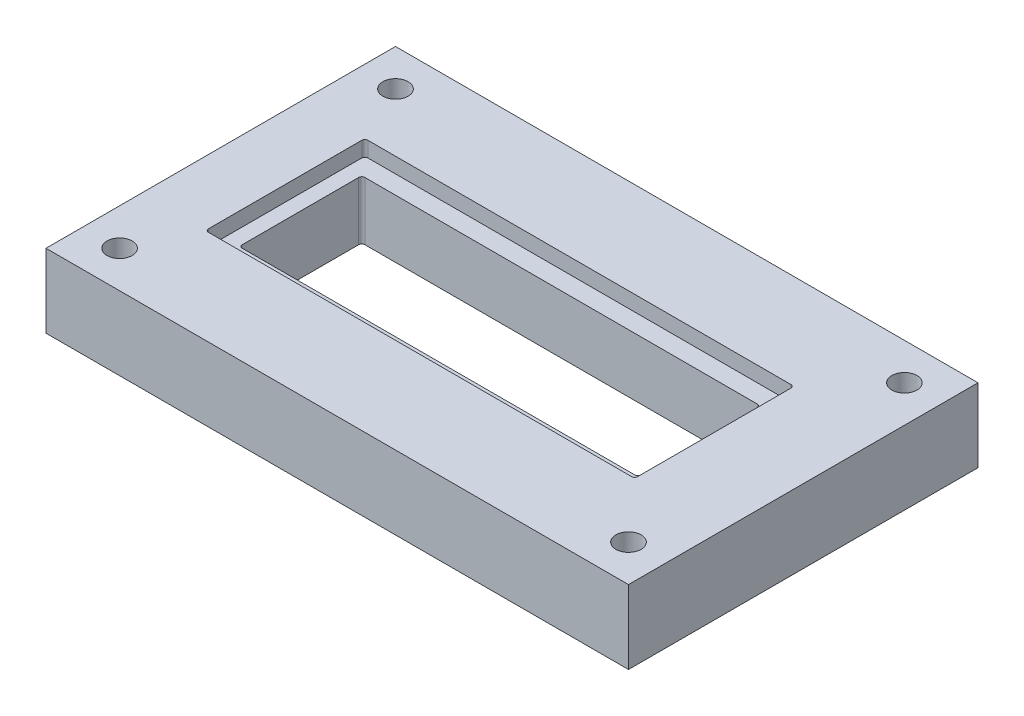
ISO-10303-21;
HEADER;
FILE_DESCRIPTION(('STEP AP214'),'2;1');
FILE_NAME('part.step','',(''),(''),'','','');
FILE_SCHEMA(('AUTOMOTIVE_DESIGN { 1 0 10303 214 1 1 1 1 }'));
ENDSEC;
DATA;
#1=APPLICATION_CONTEXT('core data for automotive mechanical design processes');
#2=APPLICATION_PROTOCOL_DEFINITION('international standard','automotive_design',2000,#1);
#3=PRODUCT_CONTEXT('',#1,'mechanical');
#4=PRODUCT('Part','Part','',(#3));
#5=PRODUCT_RELATED_PRODUCT_CATEGORY('part','',(#4));
#6=PRODUCT_DEFINITION_FORMATION('','',#4);
#7=PRODUCT_DEFINITION_CONTEXT('part definition',#1,'design');
#8=PRODUCT_DEFINITION('design','',#6,#7);
#9=PRODUCT_DEFINITION_SHAPE('','',#8);
#10=(LENGTH_UNIT() NAMED_UNIT(*) SI_UNIT(.MILLI.,.METRE.));
#11=(NAMED_UNIT(*) PLANE_ANGLE_UNIT() SI_UNIT($,.RADIAN.));
#12=(NAMED_UNIT(*) SI_UNIT($,.STERADIAN.) SOLID_ANGLE_UNIT());
#13=UNCERTAINTY_MEASURE_WITH_UNIT(LENGTH_MEASURE(1.E-05),#10,'distance_accuracy_value','');
#14=(GEOMETRIC_REPRESENTATION_CONTEXT(3) GLOBAL_UNCERTAINTY_ASSIGNED_CONTEXT((#13)) GLOBAL_UNIT_ASSIGNED_CONTEXT((#10,
#11,#12)) REPRESENTATION_CONTEXT('',''));
#15=CARTESIAN_POINT('',(0.,0.,0.));
#16=DIRECTION('',(0.,0.,1.));
#17=DIRECTION('',(1.,0.,0.));
#18=AXIS2_PLACEMENT_3D('',#15,#16,#17);
#19=CARTESIAN_POINT('',(-37.,12.,0.));
#20=DIRECTION('',(1.,0.,0.));
#21=DIRECTION('',(0.,0.,-1.));
#22=AXIS2_PLACEMENT_3D('',#19,#20,#21);
#23=PLANE('',#22);
#24=DIRECTION('',(0.,0.,1.));
#25=VECTOR('',#24,1.);
#26=CARTESIAN_POINT('',(-37.,9.5,0.));
#27=LINE('',#26,#25);
#28=CARTESIAN_POINT('',(-37.,9.5,-12.5));
#29=VERTEX_POINT('',#28);
#30=CARTESIAN_POINT('',(-37.,9.5,12.5));
#31=VERTEX_POINT('',#30);
#32=EDGE_CURVE('E50',#29,#31,#27,.T.);
#33=ORIENTED_EDGE('',*,*,#32,.F.);
#34=DIRECTION('',(0.,-1.,0.));
#35=VECTOR('',#34,1.);
#36=CARTESIAN_POINT('',(-37.,12.,-12.5));
#37=LINE('',#36,#35);
#38=CARTESIAN_POINT('',(-37.,12.,-12.5));
#39=VERTEX_POINT('',#38);
#40=EDGE_CURVE('E11',#39,#29,#37,.T.);
#41=ORIENTED_EDGE('',*,*,#40,.F.);
#42=DIRECTION('',(0.,0.,1.));
#43=VECTOR('',#42,1.);
#44=CARTESIAN_POINT('',(-37.,12.,0.));
#45=LINE('',#44,#43);
#46=CARTESIAN_POINT('',(-37.,12.,12.5));
#47=VERTEX_POINT('',#46);
#48=EDGE_CURVE('E317',#39,#47,#45,.T.);
#49=ORIENTED_EDGE('',*,*,#48,.T.);
#50=DIRECTION('',(0.,-1.,0.));
#51=VECTOR('',#50,1.);
#52=CARTESIAN_POINT('',(-37.,12.,12.5));
#53=LINE('',#52,#51);
#54=EDGE_CURVE('E175',#47,#31,#53,.T.);
#55=ORIENTED_EDGE('',*,*,#54,.T.);
#56=EDGE_LOOP('',(#33,#41,#49,#55));
#57=FACE_BOUND('',#56,.T.);
#58=ADVANCED_FACE('F33',(#57),#23,.T.);
#59=CARTESIAN_POINT('',(-36.5,12.,-12.5));
#60=DIRECTION('',(0.,-1.,0.));
#61=DIRECTION('',(0.,0.,-1.));
#62=AXIS2_PLACEMENT_3D('',#59,#60,#61);
#63=CYLINDRICAL_SURFACE('',#62,0.500000000000003);
#64=ORIENTED_EDGE('',*,*,#40,.T.);
#65=CARTESIAN_POINT('',(-36.5,9.5,-12.5));
#66=DIRECTION('',(0.,1.,0.));
#67=DIRECTION('',(0.,0.,1.));
#68=AXIS2_PLACEMENT_3D('',#65,#66,#67);
#69=CIRCLE('',#68,0.500000000000003);
#70=CARTESIAN_POINT('',(-36.5,9.5,-13.));
#71=VERTEX_POINT('',#70);
#72=EDGE_CURVE('E299',#29,#71,#69,.F.);
#73=ORIENTED_EDGE('',*,*,#72,.T.);
#74=DIRECTION('',(0.,-1.,0.));
#75=VECTOR('',#74,1.);
#76=CARTESIAN_POINT('',(-36.5,12.,-13.));
#77=LINE('',#76,#75);
#78=CARTESIAN_POINT('',(-36.5,12.,-13.));
#79=VERTEX_POINT('',#78);
#80=EDGE_CURVE('E42',#79,#71,#77,.T.);
#81=ORIENTED_EDGE('',*,*,#80,.F.);
#82=CARTESIAN_POINT('',(-36.5,12.,-12.5));
#83=DIRECTION('',(0.,1.,0.));
#84=DIRECTION('',(0.,0.,1.));
#85=AXIS2_PLACEMENT_3D('',#82,#83,#84);
#86=CIRCLE('',#85,0.500000000000003);
#87=EDGE_CURVE('E313',#39,#79,#86,.F.);
#88=ORIENTED_EDGE('',*,*,#87,.F.);
#89=EDGE_LOOP('',(#64,#73,#81,#88));
#90=FACE_BOUND('',#89,.T.);
#91=ADVANCED_FACE('F218',(#90),#63,.F.);
#92=CARTESIAN_POINT('',(0.,12.,-13.));
#93=DIRECTION('',(0.,0.,1.));
#94=DIRECTION('',(1.,0.,0.));
#95=AXIS2_PLACEMENT_3D('',#92,#93,#94);
#96=PLANE('',#95);
#97=DIRECTION('',(-1.,0.,0.));
#98=VECTOR('',#97,1.);
#99=CARTESIAN_POINT('',(0.,9.5,-13.));
#100=LINE('',#99,#98);
#101=CARTESIAN_POINT('',(32.5,9.5,-13.));
#102=VERTEX_POINT('',#101);
#103=EDGE_CURVE('E302',#102,#71,#100,.T.);
#104=ORIENTED_EDGE('',*,*,#103,.F.);
#105=DIRECTION('',(0.,-1.,0.));
#106=VECTOR('',#105,1.);
#107=CARTESIAN_POINT('',(32.5,12.,-13.));
#108=LINE('',#107,#106);
#109=CARTESIAN_POINT('',(32.5,12.,-13.));
#110=VERTEX_POINT('',#109);
#111=EDGE_CURVE('E183',#110,#102,#108,.T.);
#112=ORIENTED_EDGE('',*,*,#111,.F.);
#113=DIRECTION('',(-1.,0.,0.));
#114=VECTOR('',#113,1.);
#115=CARTESIAN_POINT('',(0.,12.,-13.));
#116=LINE('',#115,#114);
#117=EDGE_CURVE('E316',#110,#79,#116,.T.);
#118=ORIENTED_EDGE('',*,*,#117,.T.);
#119=ORIENTED_EDGE('',*,*,#80,.T.);
#120=EDGE_LOOP('',(#104,#112,#118,#119));
#121=FACE_BOUND('',#120,.T.);
#122=ADVANCED_FACE('F224',(#121),#96,.T.);
#123=CARTESIAN_POINT('',(32.5,12.,-12.5));
#124=DIRECTION('',(0.,-1.,0.));
#125=DIRECTION('',(0.,0.,-1.));
#126=AXIS2_PLACEMENT_3D('',#123,#124,#125);
#127=CYLINDRICAL_SURFACE('',#126,0.5);
#128=ORIENTED_EDGE('',*,*,#111,.T.);
#129=CARTESIAN_POINT('',(32.5,9.5,-12.5));
#130=DIRECTION('',(0.,1.,0.));
#131=DIRECTION('',(0.,0.,1.));
#132=AXIS2_PLACEMENT_3D('',#129,#130,#131);
#133=CIRCLE('',#132,0.5);
#134=CARTESIAN_POINT('',(33.,9.5,-12.5));
#135=VERTEX_POINT('',#134);
#136=EDGE_CURVE('E328',#102,#135,#133,.F.);
#137=ORIENTED_EDGE('',*,*,#136,.T.);
#138=DIRECTION('',(0.,-1.,0.));
#139=VECTOR('',#138,1.);
#140=CARTESIAN_POINT('',(33.,12.,-12.5));
#141=LINE('',#140,#139);
#142=CARTESIAN_POINT('',(33.,12.,-12.5));
#143=VERTEX_POINT('',#142);
#144=EDGE_CURVE('E180',#143,#135,#141,.T.);
#145=ORIENTED_EDGE('',*,*,#144,.F.);
#146=CARTESIAN_POINT('',(32.5,12.,-12.5));
#147=DIRECTION('',(0.,1.,0.));
#148=DIRECTION('',(0.,0.,1.));
#149=AXIS2_PLACEMENT_3D('',#146,#147,#148);
#150=CIRCLE('',#149,0.5);
#151=EDGE_CURVE('E145',#110,#143,#150,.F.);
#152=ORIENTED_EDGE('',*,*,#151,.F.);
#153=EDGE_LOOP('',(#128,#137,#145,#152));
#154=FACE_BOUND('',#153,.T.);
#155=ADVANCED_FACE('F230',(#154),#127,.F.);
#156=CARTESIAN_POINT('',(33.,12.,0.));
#157=DIRECTION('',(1.,0.,0.));
#158=DIRECTION('',(0.,0.,-1.));
#159=AXIS2_PLACEMENT_3D('',#156,#157,#158);
#160=PLANE('',#159);
#161=ORIENTED_EDGE('',*,*,#144,.T.);
#162=DIRECTION('',(0.,0.,1.));
#163=VECTOR('',#162,1.);
#164=CARTESIAN_POINT('',(33.,9.5,0.));
#165=LINE('',#164,#163);
#166=CARTESIAN_POINT('',(33.,9.5,12.5));
#167=VERTEX_POINT('',#166);
#168=EDGE_CURVE('E332',#135,#167,#165,.T.);
#169=ORIENTED_EDGE('',*,*,#168,.T.);
#170=DIRECTION('',(0.,-1.,0.));
#171=VECTOR('',#170,1.);
#172=CARTESIAN_POINT('',(33.,12.,12.5));
#173=LINE('',#172,#171);
#174=CARTESIAN_POINT('',(33.,12.,12.5));
#175=VERTEX_POINT('',#174);
#176=EDGE_CURVE('E132',#175,#167,#173,.T.);
#177=ORIENTED_EDGE('',*,*,#176,.F.);
#178=DIRECTION('',(0.,0.,1.));
#179=VECTOR('',#178,1.);
#180=CARTESIAN_POINT('',(33.,12.,0.));
#181=LINE('',#180,#179);
#182=EDGE_CURVE('E142',#143,#175,#181,.T.);
#183=ORIENTED_EDGE('',*,*,#182,.F.);
#184=EDGE_LOOP('',(#161,#169,#177,#183));
#185=FACE_BOUND('',#184,.T.);
#186=ADVANCED_FACE('F234',(#185),#160,.F.);
#187=CARTESIAN_POINT('',(32.5,12.,12.5));
#188=DIRECTION('',(0.,-1.,0.));
#189=DIRECTION('',(0.,0.,-1.));
#190=AXIS2_PLACEMENT_3D('',#187,#188,#189);
#191=CYLINDRICAL_SURFACE('',#190,0.5);
#192=CARTESIAN_POINT('',(32.5,9.5,12.5));
#193=DIRECTION('',(0.,1.,0.));
#194=DIRECTION('',(0.,0.,1.));
#195=AXIS2_PLACEMENT_3D('',#192,#193,#194);
#196=CIRCLE('',#195,0.5);
#197=CARTESIAN_POINT('',(32.5,9.5,13.));
#198=VERTEX_POINT('',#197);
#199=EDGE_CURVE('E129',#198,#167,#196,.T.);
#200=ORIENTED_EDGE('',*,*,#199,.F.);
#201=DIRECTION('',(0.,-1.,0.));
#202=VECTOR('',#201,1.);
#203=CARTESIAN_POINT('',(32.5,12.,13.));
#204=LINE('',#203,#202);
#205=CARTESIAN_POINT('',(32.5,12.,13.));
#206=VERTEX_POINT('',#205);
#207=EDGE_CURVE('E121',#206,#198,#204,.T.);
#208=ORIENTED_EDGE('',*,*,#207,.F.);
#209=CARTESIAN_POINT('',(32.5,12.,12.5));
#210=DIRECTION('',(0.,1.,0.));
#211=DIRECTION('',(0.,0.,1.));
#212=AXIS2_PLACEMENT_3D('',#209,#210,#211);
#213=CIRCLE('',#212,0.5);
#214=EDGE_CURVE('E126',#206,#175,#213,.T.);
#215=ORIENTED_EDGE('',*,*,#214,.T.);
#216=ORIENTED_EDGE('',*,*,#176,.T.);
#217=EDGE_LOOP('',(#200,#208,#215,#216));
#218=FACE_BOUND('',#217,.T.);
#219=ADVANCED_FACE('F123',(#218),#191,.F.);
#220=CARTESIAN_POINT('',(0.,12.,13.));
#221=DIRECTION('',(0.,0.,1.));
#222=DIRECTION('',(1.,0.,0.));
#223=AXIS2_PLACEMENT_3D('',#220,#221,#222);
#224=PLANE('',#223);
#225=ORIENTED_EDGE('',*,*,#207,.T.);
#226=DIRECTION('',(-1.,0.,0.));
#227=VECTOR('',#226,1.);
#228=CARTESIAN_POINT('',(0.,9.5,13.));
#229=LINE('',#228,#227);
#230=CARTESIAN_POINT('',(-36.5,9.5,13.));
#231=VERTEX_POINT('',#230);
#232=EDGE_CURVE('E391',#198,#231,#229,.T.);
#233=ORIENTED_EDGE('',*,*,#232,.T.);
#234=DIRECTION('',(0.,-1.,0.));
#235=VECTOR('',#234,1.);
#236=CARTESIAN_POINT('',(-36.5,12.,13.));
#237=LINE('',#236,#235);
#238=CARTESIAN_POINT('',(-36.5,12.,13.));
#239=VERTEX_POINT('',#238);
#240=EDGE_CURVE('E133',#239,#231,#237,.T.);
#241=ORIENTED_EDGE('',*,*,#240,.F.);
#242=DIRECTION('',(-1.,0.,0.));
#243=VECTOR('',#242,1.);
#244=CARTESIAN_POINT('',(0.,12.,13.));
#245=LINE('',#244,#243);
#246=EDGE_CURVE('E136',#206,#239,#245,.T.);
#247=ORIENTED_EDGE('',*,*,#246,.F.);
#248=EDGE_LOOP('',(#225,#233,#241,#247));
#249=FACE_BOUND('',#248,.T.);
#250=ADVANCED_FACE('F137',(#249),#224,.F.);
#251=CARTESIAN_POINT('',(0.,12.,-28.5));
#252=DIRECTION('',(0.,0.,1.));
#253=DIRECTION('',(1.,0.,0.));
#254=AXIS2_PLACEMENT_3D('',#251,#252,#253);
#255=PLANE('',#254);
#256=DIRECTION('',(-1.,0.,0.));
#257=VECTOR('',#256,1.);
#258=CARTESIAN_POINT('',(0.,0.,-28.5));
#259=LINE('',#258,#257);
#260=CARTESIAN_POINT('',(47.5,0.,-28.5));
#261=VERTEX_POINT('',#260);
#262=CARTESIAN_POINT('',(-47.5,0.,-28.5));
#263=VERTEX_POINT('',#262);
#264=EDGE_CURVE('E163',#261,#263,#259,.T.);
#265=ORIENTED_EDGE('',*,*,#264,.T.);
#266=DIRECTION('',(0.,-1.,0.));
#267=VECTOR('',#266,1.);
#268=CARTESIAN_POINT('',(-47.5,12.,-28.5));
#269=LINE('',#268,#267);
#270=CARTESIAN_POINT('',(-47.5,12.,-28.5));
#271=VERTEX_POINT('',#270);
#272=EDGE_CURVE('E37',#271,#263,#269,.T.);
#273=ORIENTED_EDGE('',*,*,#272,.F.);
#274=DIRECTION('',(-1.,0.,0.));
#275=VECTOR('',#274,1.);
#276=CARTESIAN_POINT('',(0.,12.,-28.5));
#277=LINE('',#276,#275);
#278=CARTESIAN_POINT('',(47.5,12.,-28.5));
#279=VERTEX_POINT('',#278);
#280=EDGE_CURVE('E446',#279,#271,#277,.T.);
#281=ORIENTED_EDGE('',*,*,#280,.F.);
#282=DIRECTION('',(0.,-1.,0.));
#283=VECTOR('',#282,1.);
#284=CARTESIAN_POINT('',(47.5,12.,-28.5));
#285=LINE('',#284,#283);
#286=EDGE_CURVE('E81',#279,#261,#285,.T.);
#287=ORIENTED_EDGE('',*,*,#286,.T.);
#288=EDGE_LOOP('',(#265,#273,#281,#287));
#289=FACE_BOUND('',#288,.T.);
#290=ADVANCED_FACE('F196',(#289),#255,.F.);
#291=CARTESIAN_POINT('',(-47.5,12.,0.));
#292=DIRECTION('',(1.,0.,0.));
#293=DIRECTION('',(0.,0.,-1.));
#294=AXIS2_PLACEMENT_3D('',#291,#292,#293);
#295=PLANE('',#294);
#296=DIRECTION('',(0.,0.,1.));
#297=VECTOR('',#296,1.);
#298=CARTESIAN_POINT('',(-47.5,0.,0.));
#299=LINE('',#298,#297);
#300=CARTESIAN_POINT('',(-47.5,0.,28.5));
#301=VERTEX_POINT('',#300);
#302=EDGE_CURVE('E165',#263,#301,#299,.T.);
#303=ORIENTED_EDGE('',*,*,#302,.T.);
#304=DIRECTION('',(0.,-1.,0.));
#305=VECTOR('',#304,1.);
#306=CARTESIAN_POINT('',(-47.5,12.,28.5));
#307=LINE('',#306,#305);
#308=CARTESIAN_POINT('',(-47.5,12.,28.5));
#309=VERTEX_POINT('',#308);
#310=EDGE_CURVE('E190',#309,#301,#307,.T.);
#311=ORIENTED_EDGE('',*,*,#310,.F.);
#312=DIRECTION('',(0.,0.,1.));
#313=VECTOR('',#312,1.);
#314=CARTESIAN_POINT('',(-47.5,12.,0.));
#315=LINE('',#314,#313);
#316=EDGE_CURVE('E90',#271,#309,#315,.T.);
#317=ORIENTED_EDGE('',*,*,#316,.F.);
#318=ORIENTED_EDGE('',*,*,#272,.T.);
#319=EDGE_LOOP('',(#303,#311,#317,#318));
#320=FACE_BOUND('',#319,.T.);
#321=ADVANCED_FACE('F195',(#320),#295,.F.);
#322=CARTESIAN_POINT('',(0.,12.,28.5));
#323=DIRECTION('',(0.,0.,1.));
#324=DIRECTION('',(1.,0.,0.));
#325=AXIS2_PLACEMENT_3D('',#322,#323,#324);
#326=PLANE('',#325);
#327=DIRECTION('',(-1.,0.,0.));
#328=VECTOR('',#327,1.);
#329=CARTESIAN_POINT('',(0.,0.,28.5));
#330=LINE('',#329,#328);
#331=CARTESIAN_POINT('',(47.5,0.,28.5));
#332=VERTEX_POINT('',#331);
#333=EDGE_CURVE('E168',#332,#301,#330,.T.);
#334=ORIENTED_EDGE('',*,*,#333,.F.);
#335=DIRECTION('',(0.,-1.,0.));
#336=VECTOR('',#335,1.);
#337=CARTESIAN_POINT('',(47.5,12.,28.5));
#338=LINE('',#337,#336);
#339=CARTESIAN_POINT('',(47.5,12.,28.5));
#340=VERTEX_POINT('',#339);
#341=EDGE_CURVE('E189',#340,#332,#338,.T.);
#342=ORIENTED_EDGE('',*,*,#341,.F.);
#343=DIRECTION('',(-1.,0.,0.));
#344=VECTOR('',#343,1.);
#345=CARTESIAN_POINT('',(0.,12.,28.5));
#346=LINE('',#345,#344);
#347=EDGE_CURVE('E320',#340,#309,#346,.T.);
#348=ORIENTED_EDGE('',*,*,#347,.T.);
#349=ORIENTED_EDGE('',*,*,#310,.T.);
#350=EDGE_LOOP('',(#334,#342,#348,#349));
#351=FACE_BOUND('',#350,.T.);
#352=ADVANCED_FACE('F207',(#351),#326,.T.);
#353=CARTESIAN_POINT('',(47.5,12.,0.));
#354=DIRECTION('',(1.,0.,0.));
#355=DIRECTION('',(0.,0.,-1.));
#356=AXIS2_PLACEMENT_3D('',#353,#354,#355);
#357=PLANE('',#356);
#358=DIRECTION('',(0.,0.,1.));
#359=VECTOR('',#358,1.);
#360=CARTESIAN_POINT('',(47.5,0.,0.));
#361=LINE('',#360,#359);
#362=EDGE_CURVE('E171',#261,#332,#361,.T.);
#363=ORIENTED_EDGE('',*,*,#362,.F.);
#364=ORIENTED_EDGE('',*,*,#286,.F.);
#365=DIRECTION('',(0.,0.,1.));
#366=VECTOR('',#365,1.);
#367=CARTESIAN_POINT('',(47.5,12.,0.));
#368=LINE('',#367,#366);
#369=EDGE_CURVE('E205',#279,#340,#368,.T.);
#370=ORIENTED_EDGE('',*,*,#369,.T.);
#371=ORIENTED_EDGE('',*,*,#341,.T.);
#372=EDGE_LOOP('',(#363,#364,#370,#371));
#373=FACE_BOUND('',#372,.T.);
#374=ADVANCED_FACE('F202',(#373),#357,.T.);
#375=CARTESIAN_POINT('',(-41.5,12.,22.5));
#376=DIRECTION('',(0.,-1.,0.));
#377=DIRECTION('',(0.,0.,-1.));
#378=AXIS2_PLACEMENT_3D('',#375,#376,#377);
#379=CYLINDRICAL_SURFACE('',#378,2.05798302171012);
#380=CARTESIAN_POINT('',(-41.5,12.,22.5));
#381=DIRECTION('',(0.,1.,0.));
#382=DIRECTION('',(0.,0.,1.));
#383=AXIS2_PLACEMENT_3D('',#380,#381,#382);
#384=CIRCLE('',#383,2.05798302171012);
#385=CARTESIAN_POINT('',(-41.5,12.,24.5579830217101));
#386=VERTEX_POINT('',#385);
#387=EDGE_CURVE('E443',#386,#386,#384,.T.);
#388=ORIENTED_EDGE('',*,*,#387,.T.);
#389=EDGE_LOOP('',(#388));
#390=FACE_BOUND('',#389,.T.);
#391=CARTESIAN_POINT('',(-41.5,0.,22.5));
#392=DIRECTION('',(0.,1.,0.));
#393=DIRECTION('',(0.,0.,1.));
#394=AXIS2_PLACEMENT_3D('',#391,#392,#393);
#395=CIRCLE('',#394,2.05798302171012);
#396=CARTESIAN_POINT('',(-41.5,0.,24.5579830217101));
#397=VERTEX_POINT('',#396);
#398=EDGE_CURVE('E160',#397,#397,#395,.T.);
#399=ORIENTED_EDGE('',*,*,#398,.F.);
#400=EDGE_LOOP('',(#399));
#401=FACE_BOUND('',#400,.T.);
#402=ADVANCED_FACE('F214',(#390,#401),#379,.F.);
#403=CARTESIAN_POINT('',(41.5,12.,22.5));
#404=DIRECTION('',(0.,-1.,0.));
#405=DIRECTION('',(0.,0.,-1.));
#406=AXIS2_PLACEMENT_3D('',#403,#404,#405);
#407=CYLINDRICAL_SURFACE('',#406,2.05798302171012);
#408=CARTESIAN_POINT('',(41.5,12.,22.5));
#409=DIRECTION('',(0.,1.,0.));
#410=DIRECTION('',(0.,0.,1.));
#411=AXIS2_PLACEMENT_3D('',#408,#409,#410);
#412=CIRCLE('',#411,2.05798302171012);
#413=CARTESIAN_POINT('',(41.5,12.,24.5579830217101));
#414=VERTEX_POINT('',#413);
#415=EDGE_CURVE('E440',#414,#414,#412,.T.);
#416=ORIENTED_EDGE('',*,*,#415,.T.);
#417=EDGE_LOOP('',(#416));
#418=FACE_BOUND('',#417,.T.);
#419=CARTESIAN_POINT('',(41.5,0.,22.5));
#420=DIRECTION('',(0.,1.,0.));
#421=DIRECTION('',(0.,0.,1.));
#422=AXIS2_PLACEMENT_3D('',#419,#420,#421);
#423=CIRCLE('',#422,2.05798302171012);
#424=CARTESIAN_POINT('',(41.5,0.,24.5579830217101));
#425=VERTEX_POINT('',#424);
#426=EDGE_CURVE('E157',#425,#425,#423,.T.);
#427=ORIENTED_EDGE('',*,*,#426,.F.);
#428=EDGE_LOOP('',(#427));
#429=FACE_BOUND('',#428,.T.);
#430=ADVANCED_FACE('F454',(#418,#429),#407,.F.);
#431=CARTESIAN_POINT('',(-41.5,12.,-22.5));
#432=DIRECTION('',(0.,-1.,0.));
#433=DIRECTION('',(0.,0.,-1.));
#434=AXIS2_PLACEMENT_3D('',#431,#432,#433);
#435=CYLINDRICAL_SURFACE('',#434,2.05798302171012);
#436=CARTESIAN_POINT('',(-41.5,12.,-22.5));
#437=DIRECTION('',(0.,1.,0.));
#438=DIRECTION('',(0.,0.,1.));
#439=AXIS2_PLACEMENT_3D('',#436,#437,#438);
#440=CIRCLE('',#439,2.05798302171012);
#441=CARTESIAN_POINT('',(-41.5,12.,-20.4420169782899));
#442=VERTEX_POINT('',#441);
#443=EDGE_CURVE('E437',#442,#442,#440,.T.);
#444=ORIENTED_EDGE('',*,*,#443,.T.);
#445=EDGE_LOOP('',(#444));
#446=FACE_BOUND('',#445,.T.);
#447=CARTESIAN_POINT('',(-41.5,0.,-22.5));
#448=DIRECTION('',(0.,1.,0.));
#449=DIRECTION('',(0.,0.,1.));
#450=AXIS2_PLACEMENT_3D('',#447,#448,#449);
#451=CIRCLE('',#450,2.05798302171012);
#452=CARTESIAN_POINT('',(-41.5,0.,-20.4420169782899));
#453=VERTEX_POINT('',#452);
#454=EDGE_CURVE('E153',#453,#453,#451,.T.);
#455=ORIENTED_EDGE('',*,*,#454,.F.);
#456=EDGE_LOOP('',(#455));
#457=FACE_BOUND('',#456,.T.);
#458=ADVANCED_FACE('F461',(#446,#457),#435,.F.);
#459=CARTESIAN_POINT('',(41.5,12.,-22.5));
#460=DIRECTION('',(0.,-1.,0.));
#461=DIRECTION('',(0.,0.,-1.));
#462=AXIS2_PLACEMENT_3D('',#459,#460,#461);
#463=CYLINDRICAL_SURFACE('',#462,2.05798302171012);
#464=CARTESIAN_POINT('',(41.5,12.,-22.5));
#465=DIRECTION('',(0.,1.,0.));
#466=DIRECTION('',(0.,0.,1.));
#467=AXIS2_PLACEMENT_3D('',#464,#465,#466);
#468=CIRCLE('',#467,2.05798302171012);
#469=CARTESIAN_POINT('',(41.5,12.,-20.4420169782899));
#470=VERTEX_POINT('',#469);
#471=EDGE_CURVE('E174',#470,#470,#468,.T.);
#472=ORIENTED_EDGE('',*,*,#471,.T.);
#473=EDGE_LOOP('',(#472));
#474=FACE_BOUND('',#473,.T.);
#475=CARTESIAN_POINT('',(41.5,0.,-22.5));
#476=DIRECTION('',(0.,1.,0.));
#477=DIRECTION('',(0.,0.,1.));
#478=AXIS2_PLACEMENT_3D('',#475,#476,#477);
#479=CIRCLE('',#478,2.05798302171012);
#480=CARTESIAN_POINT('',(41.5,0.,-20.4420169782899));
#481=VERTEX_POINT('',#480);
#482=EDGE_CURVE('E150',#481,#481,#479,.T.);
#483=ORIENTED_EDGE('',*,*,#482,.F.);
#484=EDGE_LOOP('',(#483));
#485=FACE_BOUND('',#484,.T.);
#486=ADVANCED_FACE('F35',(#474,#485),#463,.F.);
#487=CARTESIAN_POINT('',(-36.5,12.,12.5));
#488=DIRECTION('',(0.,-1.,0.));
#489=DIRECTION('',(0.,0.,-1.));
#490=AXIS2_PLACEMENT_3D('',#487,#488,#489);
#491=CYLINDRICAL_SURFACE('',#490,0.5);
#492=ORIENTED_EDGE('',*,*,#240,.T.);
#493=CARTESIAN_POINT('',(-36.5,9.5,12.5));
#494=DIRECTION('',(0.,1.,0.));
#495=DIRECTION('',(0.,0.,1.));
#496=AXIS2_PLACEMENT_3D('',#493,#494,#495);
#497=CIRCLE('',#496,0.5);
#498=EDGE_CURVE('E311',#231,#31,#497,.F.);
#499=ORIENTED_EDGE('',*,*,#498,.T.);
#500=ORIENTED_EDGE('',*,*,#54,.F.);
#501=CARTESIAN_POINT('',(-36.5,12.,12.5));
#502=DIRECTION('',(0.,1.,0.));
#503=DIRECTION('',(0.,0.,1.));
#504=AXIS2_PLACEMENT_3D('',#501,#502,#503);
#505=CIRCLE('',#504,0.5);
#506=EDGE_CURVE('E59',#239,#47,#505,.F.);
#507=ORIENTED_EDGE('',*,*,#506,.F.);
#508=EDGE_LOOP('',(#492,#499,#500,#507));
#509=FACE_BOUND('',#508,.T.);
#510=ADVANCED_FACE('F243',(#509),#491,.F.);
#511=CARTESIAN_POINT('',(0.,12.,0.));
#512=DIRECTION('',(0.,1.,0.));
#513=DIRECTION('',(0.,0.,1.));
#514=AXIS2_PLACEMENT_3D('',#511,#512,#513);
#515=PLANE('',#514);
#516=ORIENTED_EDGE('',*,*,#471,.F.);
#517=EDGE_LOOP('',(#516));
#518=FACE_BOUND('',#517,.T.);
#519=ORIENTED_EDGE('',*,*,#443,.F.);
#520=EDGE_LOOP('',(#519));
#521=FACE_BOUND('',#520,.T.);
#522=ORIENTED_EDGE('',*,*,#415,.F.);
#523=EDGE_LOOP('',(#522));
#524=FACE_BOUND('',#523,.T.);
#525=ORIENTED_EDGE('',*,*,#387,.F.);
#526=EDGE_LOOP('',(#525));
#527=FACE_BOUND('',#526,.T.);
#528=ORIENTED_EDGE('',*,*,#280,.T.);
#529=ORIENTED_EDGE('',*,*,#316,.T.);
#530=ORIENTED_EDGE('',*,*,#347,.F.);
#531=ORIENTED_EDGE('',*,*,#369,.F.);
#532=EDGE_LOOP('',(#528,#529,#530,#531));
#533=FACE_BOUND('',#532,.T.);
#534=ORIENTED_EDGE('',*,*,#48,.F.);
#535=ORIENTED_EDGE('',*,*,#87,.T.);
#536=ORIENTED_EDGE('',*,*,#117,.F.);
#537=ORIENTED_EDGE('',*,*,#151,.T.);
#538=ORIENTED_EDGE('',*,*,#182,.T.);
#539=ORIENTED_EDGE('',*,*,#214,.F.);
#540=ORIENTED_EDGE('',*,*,#246,.T.);
#541=ORIENTED_EDGE('',*,*,#506,.T.);
#542=EDGE_LOOP('',(#534,#535,#536,#537,#538,#539,#540,#541));
#543=FACE_BOUND('',#542,.T.);
#544=ADVANCED_FACE('F140',(#518,#521,#524,#527,#533,#543),#515,.T.);
#545=CARTESIAN_POINT('',(0.,0.,0.));
#546=DIRECTION('',(0.,1.,0.));
#547=DIRECTION('',(0.,0.,1.));
#548=AXIS2_PLACEMENT_3D('',#545,#546,#547);
#549=PLANE('',#548);
#550=ORIENTED_EDGE('',*,*,#482,.T.);
#551=EDGE_LOOP('',(#550));
#552=FACE_BOUND('',#551,.T.);
#553=ORIENTED_EDGE('',*,*,#454,.T.);
#554=EDGE_LOOP('',(#553));
#555=FACE_BOUND('',#554,.T.);
#556=ORIENTED_EDGE('',*,*,#426,.T.);
#557=EDGE_LOOP('',(#556));
#558=FACE_BOUND('',#557,.T.);
#559=ORIENTED_EDGE('',*,*,#398,.T.);
#560=EDGE_LOOP('',(#559));
#561=FACE_BOUND('',#560,.T.);
#562=ORIENTED_EDGE('',*,*,#264,.F.);
#563=ORIENTED_EDGE('',*,*,#362,.T.);
#564=ORIENTED_EDGE('',*,*,#333,.T.);
#565=ORIENTED_EDGE('',*,*,#302,.F.);
#566=EDGE_LOOP('',(#562,#563,#564,#565));
#567=FACE_BOUND('',#566,.T.);
#568=CARTESIAN_POINT('',(30.,0.,9.49999999999999));
#569=DIRECTION('',(0.,1.,0.));
#570=DIRECTION('',(0.,0.,1.));
#571=AXIS2_PLACEMENT_3D('',#568,#569,#570);
#572=CIRCLE('',#571,0.5);
#573=CARTESIAN_POINT('',(30.,0.,9.99999999999999));
#574=VERTEX_POINT('',#573);
#575=CARTESIAN_POINT('',(30.5,0.,9.49999999999999));
#576=VERTEX_POINT('',#575);
#577=EDGE_CURVE('E399',#574,#576,#572,.T.);
#578=ORIENTED_EDGE('',*,*,#577,.T.);
#579=DIRECTION('',(0.,0.,-1.));
#580=VECTOR('',#579,1.);
#581=CARTESIAN_POINT('',(30.5,0.,0.));
#582=LINE('',#581,#580);
#583=CARTESIAN_POINT('',(30.5,0.,-9.5));
#584=VERTEX_POINT('',#583);
#585=EDGE_CURVE('E417',#576,#584,#582,.T.);
#586=ORIENTED_EDGE('',*,*,#585,.T.);
#587=CARTESIAN_POINT('',(30.,0.,-9.50000000000001));
#588=DIRECTION('',(0.,1.,0.));
#589=DIRECTION('',(0.,0.,1.));
#590=AXIS2_PLACEMENT_3D('',#587,#588,#589);
#591=CIRCLE('',#590,0.5);
#592=CARTESIAN_POINT('',(30.,0.,-10.));
#593=VERTEX_POINT('',#592);
#594=EDGE_CURVE('E414',#584,#593,#591,.T.);
#595=ORIENTED_EDGE('',*,*,#594,.T.);
#596=DIRECTION('',(-1.,0.,0.));
#597=VECTOR('',#596,1.);
#598=CARTESIAN_POINT('',(0.,0.,-10.));
#599=LINE('',#598,#597);
#600=CARTESIAN_POINT('',(-34.,0.,-10.));
#601=VERTEX_POINT('',#600);
#602=EDGE_CURVE('E411',#593,#601,#599,.T.);
#603=ORIENTED_EDGE('',*,*,#602,.T.);
#604=CARTESIAN_POINT('',(-34.,0.,-9.5));
#605=DIRECTION('',(0.,1.,0.));
#606=DIRECTION('',(0.,0.,1.));
#607=AXIS2_PLACEMENT_3D('',#604,#605,#606);
#608=CIRCLE('',#607,0.5);
#609=CARTESIAN_POINT('',(-34.5,0.,-9.49999999999999));
#610=VERTEX_POINT('',#609);
#611=EDGE_CURVE('E408',#601,#610,#608,.T.);
#612=ORIENTED_EDGE('',*,*,#611,.T.);
#613=DIRECTION('',(0.,0.,-1.));
#614=VECTOR('',#613,1.);
#615=CARTESIAN_POINT('',(-34.5,0.,0.));
#616=LINE('',#615,#614);
#617=CARTESIAN_POINT('',(-34.5,0.,9.5));
#618=VERTEX_POINT('',#617);
#619=EDGE_CURVE('E405',#618,#610,#616,.T.);
#620=ORIENTED_EDGE('',*,*,#619,.F.);
#621=CARTESIAN_POINT('',(-34.,0.,9.5));
#622=DIRECTION('',(0.,1.,0.));
#623=DIRECTION('',(0.,0.,1.));
#624=AXIS2_PLACEMENT_3D('',#621,#622,#623);
#625=CIRCLE('',#624,0.5);
#626=CARTESIAN_POINT('',(-34.,0.,10.));
#627=VERTEX_POINT('',#626);
#628=EDGE_CURVE('E403',#627,#618,#625,.F.);
#629=ORIENTED_EDGE('',*,*,#628,.F.);
#630=DIRECTION('',(-1.,0.,0.));
#631=VECTOR('',#630,1.);
#632=CARTESIAN_POINT('',(0.,0.,10.));
#633=LINE('',#632,#631);
#634=EDGE_CURVE('E401',#574,#627,#633,.T.);
#635=ORIENTED_EDGE('',*,*,#634,.F.);
#636=EDGE_LOOP('',(#578,#586,#595,#603,#612,#620,#629,#635));
#637=FACE_BOUND('',#636,.T.);
#638=ADVANCED_FACE('F199',(#552,#555,#558,#561,#567,#637),#549,.F.);
#639=CARTESIAN_POINT('',(30.,9.5,9.49999999999999));
#640=DIRECTION('',(0.,-1.,0.));
#641=DIRECTION('',(0.,0.,-1.));
#642=AXIS2_PLACEMENT_3D('',#639,#640,#641);
#643=CYLINDRICAL_SURFACE('',#642,0.5);
#644=ORIENTED_EDGE('',*,*,#577,.F.);
#645=DIRECTION('',(0.,-1.,0.));
#646=VECTOR('',#645,1.);
#647=CARTESIAN_POINT('',(30.,9.5,9.99999999999999));
#648=LINE('',#647,#646);
#649=CARTESIAN_POINT('',(30.,9.5,9.99999999999999));
#650=VERTEX_POINT('',#649);
#651=EDGE_CURVE('E154',#650,#574,#648,.T.);
#652=ORIENTED_EDGE('',*,*,#651,.F.);
#653=CARTESIAN_POINT('',(30.,9.5,9.49999999999999));
#654=DIRECTION('',(0.,1.,0.));
#655=DIRECTION('',(0.,0.,1.));
#656=AXIS2_PLACEMENT_3D('',#653,#654,#655);
#657=CIRCLE('',#656,0.5);
#658=CARTESIAN_POINT('',(30.5,9.5,9.49999999999999));
#659=VERTEX_POINT('',#658);
#660=EDGE_CURVE('E295',#650,#659,#657,.T.);
#661=ORIENTED_EDGE('',*,*,#660,.T.);
#662=DIRECTION('',(0.,-1.,0.));
#663=VECTOR('',#662,1.);
#664=CARTESIAN_POINT('',(30.5,9.5,9.49999999999999));
#665=LINE('',#664,#663);
#666=EDGE_CURVE('E367',#659,#576,#665,.T.);
#667=ORIENTED_EDGE('',*,*,#666,.T.);
#668=EDGE_LOOP('',(#644,#652,#661,#667));
#669=FACE_BOUND('',#668,.T.);
#670=ADVANCED_FACE('F249',(#669),#643,.F.);
#671=CARTESIAN_POINT('',(0.,9.5,10.));
#672=DIRECTION('',(0.,0.,1.));
#673=DIRECTION('',(1.,0.,0.));
#674=AXIS2_PLACEMENT_3D('',#671,#672,#673);
#675=PLANE('',#674);
#676=ORIENTED_EDGE('',*,*,#634,.T.);
#677=DIRECTION('',(0.,-1.,0.));
#678=VECTOR('',#677,1.);
#679=CARTESIAN_POINT('',(-34.,9.5,10.));
#680=LINE('',#679,#678);
#681=CARTESIAN_POINT('',(-34.,9.5,10.));
#682=VERTEX_POINT('',#681);
#683=EDGE_CURVE('E431',#682,#627,#680,.T.);
#684=ORIENTED_EDGE('',*,*,#683,.F.);
#685=DIRECTION('',(-1.,0.,0.));
#686=VECTOR('',#685,1.);
#687=CARTESIAN_POINT('',(0.,9.5,10.));
#688=LINE('',#687,#686);
#689=EDGE_CURVE('E642',#650,#682,#688,.T.);
#690=ORIENTED_EDGE('',*,*,#689,.F.);
#691=ORIENTED_EDGE('',*,*,#651,.T.);
#692=EDGE_LOOP('',(#676,#684,#690,#691));
#693=FACE_BOUND('',#692,.T.);
#694=ADVANCED_FACE('F256',(#693),#675,.F.);
#695=CARTESIAN_POINT('',(-34.,9.5,9.5));
#696=DIRECTION('',(0.,-1.,0.));
#697=DIRECTION('',(0.,0.,-1.));
#698=AXIS2_PLACEMENT_3D('',#695,#696,#697);
#699=CYLINDRICAL_SURFACE('',#698,0.5);
#700=ORIENTED_EDGE('',*,*,#628,.T.);
#701=DIRECTION('',(0.,-1.,0.));
#702=VECTOR('',#701,1.);
#703=CARTESIAN_POINT('',(-34.5,9.5,9.5));
#704=LINE('',#703,#702);
#705=CARTESIAN_POINT('',(-34.5,9.5,9.5));
#706=VERTEX_POINT('',#705);
#707=EDGE_CURVE('E428',#706,#618,#704,.T.);
#708=ORIENTED_EDGE('',*,*,#707,.F.);
#709=CARTESIAN_POINT('',(-34.,9.5,9.5));
#710=DIRECTION('',(0.,1.,0.));
#711=DIRECTION('',(0.,0.,1.));
#712=AXIS2_PLACEMENT_3D('',#709,#710,#711);
#713=CIRCLE('',#712,0.5);
#714=EDGE_CURVE('E653',#682,#706,#713,.F.);
#715=ORIENTED_EDGE('',*,*,#714,.F.);
#716=ORIENTED_EDGE('',*,*,#683,.T.);
#717=EDGE_LOOP('',(#700,#708,#715,#716));
#718=FACE_BOUND('',#717,.T.);
#719=ADVANCED_FACE('F260',(#718),#699,.F.);
#720=CARTESIAN_POINT('',(-34.5,9.5,0.));
#721=DIRECTION('',(-1.,0.,0.));
#722=DIRECTION('',(0.,0.,1.));
#723=AXIS2_PLACEMENT_3D('',#720,#721,#722);
#724=PLANE('',#723);
#725=ORIENTED_EDGE('',*,*,#619,.T.);
#726=DIRECTION('',(0.,-1.,0.));
#727=VECTOR('',#726,1.);
#728=CARTESIAN_POINT('',(-34.5,9.5,-9.49999999999999));
#729=LINE('',#728,#727);
#730=CARTESIAN_POINT('',(-34.5,9.5,-9.49999999999999));
#731=VERTEX_POINT('',#730);
#732=EDGE_CURVE('E426',#731,#610,#729,.T.);
#733=ORIENTED_EDGE('',*,*,#732,.F.);
#734=DIRECTION('',(0.,0.,-1.));
#735=VECTOR('',#734,1.);
#736=CARTESIAN_POINT('',(-34.5,9.5,0.));
#737=LINE('',#736,#735);
#738=EDGE_CURVE('E649',#706,#731,#737,.T.);
#739=ORIENTED_EDGE('',*,*,#738,.F.);
#740=ORIENTED_EDGE('',*,*,#707,.T.);
#741=EDGE_LOOP('',(#725,#733,#739,#740));
#742=FACE_BOUND('',#741,.T.);
#743=ADVANCED_FACE('F264',(#742),#724,.F.);
#744=CARTESIAN_POINT('',(-34.,9.5,-9.5));
#745=DIRECTION('',(0.,-1.,0.));
#746=DIRECTION('',(0.,0.,-1.));
#747=AXIS2_PLACEMENT_3D('',#744,#745,#746);
#748=CYLINDRICAL_SURFACE('',#747,0.5);
#749=ORIENTED_EDGE('',*,*,#611,.F.);
#750=DIRECTION('',(0.,-1.,0.));
#751=VECTOR('',#750,1.);
#752=CARTESIAN_POINT('',(-34.,9.5,-10.));
#753=LINE('',#752,#751);
#754=CARTESIAN_POINT('',(-34.,9.5,-10.));
#755=VERTEX_POINT('',#754);
#756=EDGE_CURVE('E424',#755,#601,#753,.T.);
#757=ORIENTED_EDGE('',*,*,#756,.F.);
#758=CARTESIAN_POINT('',(-34.,9.5,-9.5));
#759=DIRECTION('',(0.,1.,0.));
#760=DIRECTION('',(0.,0.,1.));
#761=AXIS2_PLACEMENT_3D('',#758,#759,#760);
#762=CIRCLE('',#761,0.5);
#763=EDGE_CURVE('E652',#755,#731,#762,.T.);
#764=ORIENTED_EDGE('',*,*,#763,.T.);
#765=ORIENTED_EDGE('',*,*,#732,.T.);
#766=EDGE_LOOP('',(#749,#757,#764,#765));
#767=FACE_BOUND('',#766,.T.);
#768=ADVANCED_FACE('F268',(#767),#748,.F.);
#769=CARTESIAN_POINT('',(0.,9.5,-10.));
#770=DIRECTION('',(0.,0.,1.));
#771=DIRECTION('',(1.,0.,0.));
#772=AXIS2_PLACEMENT_3D('',#769,#770,#771);
#773=PLANE('',#772);
#774=ORIENTED_EDGE('',*,*,#602,.F.);
#775=DIRECTION('',(0.,-1.,0.));
#776=VECTOR('',#775,1.);
#777=CARTESIAN_POINT('',(30.,9.5,-10.));
#778=LINE('',#777,#776);
#779=CARTESIAN_POINT('',(30.,9.5,-10.));
#780=VERTEX_POINT('',#779);
#781=EDGE_CURVE('E422',#780,#593,#778,.T.);
#782=ORIENTED_EDGE('',*,*,#781,.F.);
#783=DIRECTION('',(-1.,0.,0.));
#784=VECTOR('',#783,1.);
#785=CARTESIAN_POINT('',(0.,9.5,-10.));
#786=LINE('',#785,#784);
#787=EDGE_CURVE('E655',#780,#755,#786,.T.);
#788=ORIENTED_EDGE('',*,*,#787,.T.);
#789=ORIENTED_EDGE('',*,*,#756,.T.);
#790=EDGE_LOOP('',(#774,#782,#788,#789));
#791=FACE_BOUND('',#790,.T.);
#792=ADVANCED_FACE('F272',(#791),#773,.T.);
#793=CARTESIAN_POINT('',(30.,9.5,-9.50000000000001));
#794=DIRECTION('',(0.,-1.,0.));
#795=DIRECTION('',(0.,0.,-1.));
#796=AXIS2_PLACEMENT_3D('',#793,#794,#795);
#797=CYLINDRICAL_SURFACE('',#796,0.5);
#798=ORIENTED_EDGE('',*,*,#594,.F.);
#799=DIRECTION('',(0.,-1.,0.));
#800=VECTOR('',#799,1.);
#801=CARTESIAN_POINT('',(30.5,9.5,-9.5));
#802=LINE('',#801,#800);
#803=CARTESIAN_POINT('',(30.5,9.5,-9.5));
#804=VERTEX_POINT('',#803);
#805=EDGE_CURVE('E362',#804,#584,#802,.T.);
#806=ORIENTED_EDGE('',*,*,#805,.F.);
#807=CARTESIAN_POINT('',(30.,9.5,-9.50000000000001));
#808=DIRECTION('',(0.,1.,0.));
#809=DIRECTION('',(0.,0.,1.));
#810=AXIS2_PLACEMENT_3D('',#807,#808,#809);
#811=CIRCLE('',#810,0.5);
#812=EDGE_CURVE('E662',#804,#780,#811,.T.);
#813=ORIENTED_EDGE('',*,*,#812,.T.);
#814=ORIENTED_EDGE('',*,*,#781,.T.);
#815=EDGE_LOOP('',(#798,#806,#813,#814));
#816=FACE_BOUND('',#815,.T.);
#817=ADVANCED_FACE('F276',(#816),#797,.F.);
#818=CARTESIAN_POINT('',(30.5,9.5,0.));
#819=DIRECTION('',(-1.,0.,0.));
#820=DIRECTION('',(0.,0.,1.));
#821=AXIS2_PLACEMENT_3D('',#818,#819,#820);
#822=PLANE('',#821);
#823=ORIENTED_EDGE('',*,*,#585,.F.);
#824=ORIENTED_EDGE('',*,*,#666,.F.);
#825=DIRECTION('',(0.,0.,-1.));
#826=VECTOR('',#825,1.);
#827=CARTESIAN_POINT('',(30.5,9.5,0.));
#828=LINE('',#827,#826);
#829=EDGE_CURVE('E307',#659,#804,#828,.T.);
#830=ORIENTED_EDGE('',*,*,#829,.T.);
#831=ORIENTED_EDGE('',*,*,#805,.T.);
#832=EDGE_LOOP('',(#823,#824,#830,#831));
#833=FACE_BOUND('',#832,.T.);
#834=ADVANCED_FACE('F280',(#833),#822,.T.);
#835=CARTESIAN_POINT('',(0.,9.5,0.));
#836=DIRECTION('',(0.,1.,0.));
#837=DIRECTION('',(0.,0.,1.));
#838=AXIS2_PLACEMENT_3D('',#835,#836,#837);
#839=PLANE('',#838);
#840=ORIENTED_EDGE('',*,*,#660,.F.);
#841=ORIENTED_EDGE('',*,*,#689,.T.);
#842=ORIENTED_EDGE('',*,*,#714,.T.);
#843=ORIENTED_EDGE('',*,*,#738,.T.);
#844=ORIENTED_EDGE('',*,*,#763,.F.);
#845=ORIENTED_EDGE('',*,*,#787,.F.);
#846=ORIENTED_EDGE('',*,*,#812,.F.);
#847=ORIENTED_EDGE('',*,*,#829,.F.);
#848=EDGE_LOOP('',(#840,#841,#842,#843,#844,#845,#846,#847));
#849=FACE_BOUND('',#848,.T.);
#850=ORIENTED_EDGE('',*,*,#72,.F.);
#851=ORIENTED_EDGE('',*,*,#32,.T.);
#852=ORIENTED_EDGE('',*,*,#498,.F.);
#853=ORIENTED_EDGE('',*,*,#232,.F.);
#854=ORIENTED_EDGE('',*,*,#199,.T.);
#855=ORIENTED_EDGE('',*,*,#168,.F.);
#856=ORIENTED_EDGE('',*,*,#136,.F.);
#857=ORIENTED_EDGE('',*,*,#103,.T.);
#858=EDGE_LOOP('',(#850,#851,#852,#853,#854,#855,#856,#857));
#859=FACE_BOUND('',#858,.T.);
#860=ADVANCED_FACE('F284',(#849,#859),#839,.T.);
#861=CLOSED_SHELL('',(#58,#91,#122,#155,#186,#219,#250,#290,#321,#352,#374,#402,#430,#458,#486,
#510,#544,#638,#670,#694,#719,#743,#768,#792,#817,#834,#860));
#862=MANIFOLD_SOLID_BREP('B2',#861);
#863=ADVANCED_BREP_SHAPE_REPRESENTATION('',(#18,#862),#14);
#864=SHAPE_DEFINITION_REPRESENTATION(#9,#863);
ENDSEC;
END-ISO-10303-21;
